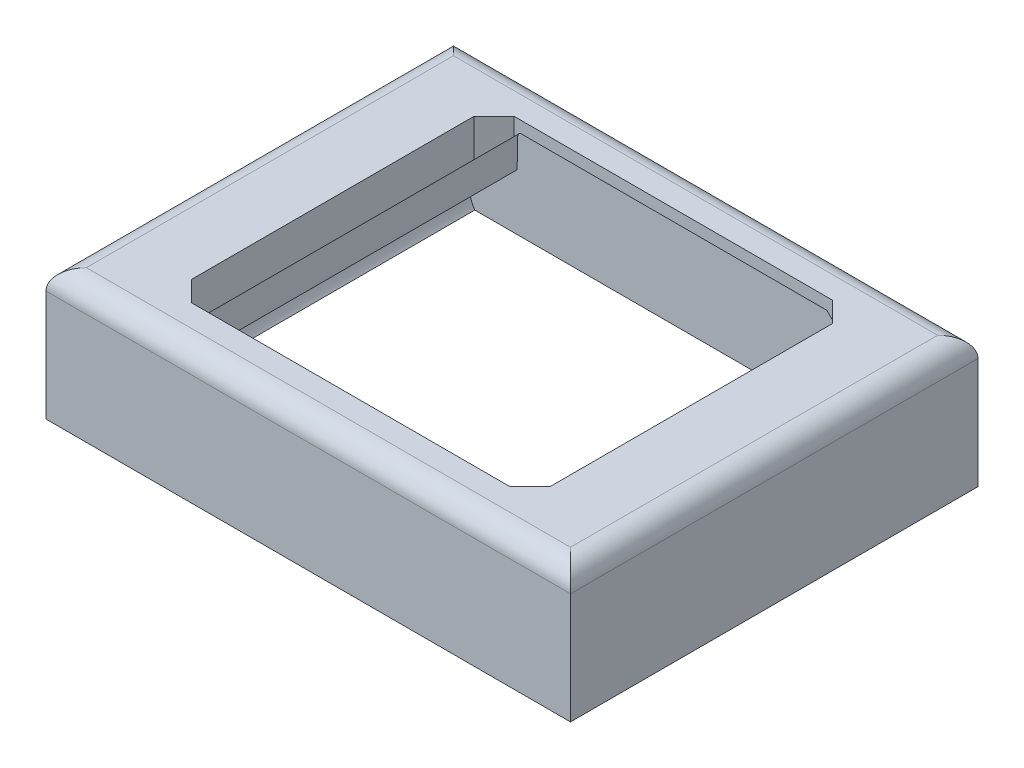
ISO-10303-21;
HEADER;
FILE_DESCRIPTION(('STEP AP214'),'2;1');
FILE_NAME('part.step','',(''),(''),'','','');
FILE_SCHEMA(('AUTOMOTIVE_DESIGN { 1 0 10303 214 1 1 1 1 }'));
ENDSEC;
DATA;
#1=APPLICATION_CONTEXT('core data for automotive mechanical design processes');
#2=APPLICATION_PROTOCOL_DEFINITION('international standard','automotive_design',2000,#1);
#3=PRODUCT_CONTEXT('',#1,'mechanical');
#4=PRODUCT('Part','Part','',(#3));
#5=PRODUCT_RELATED_PRODUCT_CATEGORY('part','',(#4));
#6=PRODUCT_DEFINITION_FORMATION('','',#4);
#7=PRODUCT_DEFINITION_CONTEXT('part definition',#1,'design');
#8=PRODUCT_DEFINITION('design','',#6,#7);
#9=PRODUCT_DEFINITION_SHAPE('','',#8);
#10=(LENGTH_UNIT() NAMED_UNIT(*) SI_UNIT(.MILLI.,.METRE.));
#11=(NAMED_UNIT(*) PLANE_ANGLE_UNIT() SI_UNIT($,.RADIAN.));
#12=(NAMED_UNIT(*) SI_UNIT($,.STERADIAN.) SOLID_ANGLE_UNIT());
#13=UNCERTAINTY_MEASURE_WITH_UNIT(LENGTH_MEASURE(1.E-05),#10,'distance_accuracy_value','');
#14=(GEOMETRIC_REPRESENTATION_CONTEXT(3) GLOBAL_UNCERTAINTY_ASSIGNED_CONTEXT((#13)) GLOBAL_UNIT_ASSIGNED_CONTEXT((#10,
#11,#12)) REPRESENTATION_CONTEXT('',''));
#15=CARTESIAN_POINT('',(0.,0.,0.));
#16=DIRECTION('',(0.,0.,1.));
#17=DIRECTION('',(1.,0.,0.));
#18=AXIS2_PLACEMENT_3D('',#15,#16,#17);
#19=CARTESIAN_POINT('',(26.732778086294,-30.0375899690606,25.654));
#20=DIRECTION('',(0.,0.,-1.));
#21=DIRECTION('',(-1.,0.,0.));
#22=AXIS2_PLACEMENT_3D('',#19,#20,#21);
#23=CYLINDRICAL_SURFACE('',#22,2.92881758219847);
#24=CARTESIAN_POINT('',(26.732778086294,-30.0375899690606,-24.13));
#25=DIRECTION('',(0.,0.,-1.));
#26=DIRECTION('',(-1.,0.,0.));
#27=AXIS2_PLACEMENT_3D('',#24,#25,#26);
#28=CIRCLE('',#27,2.92881758219847);
#29=CARTESIAN_POINT('',(29.0229942208002,-31.8632083538942,-24.13));
#30=VERTEX_POINT('',#29);
#31=CARTESIAN_POINT('',(27.8648686648209,-27.3364155297091,-24.13));
#32=VERTEX_POINT('',#31);
#33=EDGE_CURVE('E328',#30,#32,#28,.F.);
#34=ORIENTED_EDGE('',*,*,#33,.F.);
#35=DIRECTION('',(0.,0.,-1.));
#36=VECTOR('',#35,1.);
#37=CARTESIAN_POINT('',(29.0229942208002,-31.8632083538942,25.654));
#38=LINE('',#37,#36);
#39=CARTESIAN_POINT('',(29.0229942208002,-31.8632083538942,24.13));
#40=VERTEX_POINT('',#39);
#41=EDGE_CURVE('E404',#40,#30,#38,.T.);
#42=ORIENTED_EDGE('',*,*,#41,.F.);
#43=CARTESIAN_POINT('',(26.732778086294,-30.0375899690606,24.13));
#44=DIRECTION('',(0.,0.,1.));
#45=DIRECTION('',(1.,0.,0.));
#46=AXIS2_PLACEMENT_3D('',#43,#44,#45);
#47=CIRCLE('',#46,2.92881758219847);
#48=CARTESIAN_POINT('',(27.8648686648209,-27.3364155297091,24.13));
#49=VERTEX_POINT('',#48);
#50=EDGE_CURVE('E358',#49,#40,#47,.F.);
#51=ORIENTED_EDGE('',*,*,#50,.F.);
#52=DIRECTION('',(0.,0.,-1.));
#53=VECTOR('',#52,1.);
#54=CARTESIAN_POINT('',(27.8648686648209,-27.3364155297091,25.654));
#55=LINE('',#54,#53);
#56=EDGE_CURVE('E361',#49,#32,#55,.T.);
#57=ORIENTED_EDGE('',*,*,#56,.T.);
#58=EDGE_LOOP('',(#34,#42,#51,#57));
#59=FACE_BOUND('',#58,.T.);
#60=ADVANCED_FACE('F53',(#59),#23,.F.);
#61=CARTESIAN_POINT('',(-26.3052505575541,-30.027160069853,25.654));
#62=DIRECTION('',(0.,0.,-1.));
#63=DIRECTION('',(-1.,0.,0.));
#64=AXIS2_PLACEMENT_3D('',#61,#62,#63);
#65=CYLINDRICAL_SURFACE('',#64,3.11006669073643);
#66=DIRECTION('',(0.,0.,-1.));
#67=VECTOR('',#66,1.);
#68=CARTESIAN_POINT('',(-28.8155177782893,-31.8632083538942,25.654));
#69=LINE('',#68,#67);
#70=CARTESIAN_POINT('',(-28.8155177782893,-31.8632083538942,24.13));
#71=VERTEX_POINT('',#70);
#72=CARTESIAN_POINT('',(-28.8155177782893,-31.8632083538942,-24.13));
#73=VERTEX_POINT('',#72);
#74=EDGE_CURVE('E418',#71,#73,#69,.T.);
#75=ORIENTED_EDGE('',*,*,#74,.T.);
#76=CARTESIAN_POINT('',(-26.3052505575541,-30.027160069853,-24.13));
#77=DIRECTION('',(0.,0.,-1.));
#78=DIRECTION('',(-1.,0.,0.));
#79=AXIS2_PLACEMENT_3D('',#76,#77,#78);
#80=CIRCLE('',#79,3.11006669073643);
#81=CARTESIAN_POINT('',(-27.8648686648208,-27.3364155297091,-24.13));
#82=VERTEX_POINT('',#81);
#83=EDGE_CURVE('E325',#73,#82,#80,.T.);
#84=ORIENTED_EDGE('',*,*,#83,.T.);
#85=DIRECTION('',(0.,0.,-1.));
#86=VECTOR('',#85,1.);
#87=CARTESIAN_POINT('',(-27.8648686648208,-27.3364155297091,25.654));
#88=LINE('',#87,#86);
#89=CARTESIAN_POINT('',(-27.8648686648208,-27.3364155297091,24.13));
#90=VERTEX_POINT('',#89);
#91=EDGE_CURVE('E421',#90,#82,#88,.T.);
#92=ORIENTED_EDGE('',*,*,#91,.F.);
#93=CARTESIAN_POINT('',(-26.3052505575541,-30.027160069853,24.13));
#94=DIRECTION('',(0.,0.,1.));
#95=DIRECTION('',(1.,0.,0.));
#96=AXIS2_PLACEMENT_3D('',#93,#94,#95);
#97=CIRCLE('',#96,3.11006669073643);
#98=EDGE_CURVE('E354',#90,#71,#97,.T.);
#99=ORIENTED_EDGE('',*,*,#98,.T.);
#100=EDGE_LOOP('',(#75,#84,#92,#99));
#101=FACE_BOUND('',#100,.T.);
#102=ADVANCED_FACE('F585',(#101),#65,.F.);
#103=CARTESIAN_POINT('',(4.85286900296527,-8.37245394428451,25.654));
#104=DIRECTION('',(0.501474168355331,-0.865172617731473,0.));
#105=DIRECTION('',(0.865172617731473,0.501474168355331,0.));
#106=AXIS2_PLACEMENT_3D('',#103,#104,#105);
#107=PLANE('',#106);
#108=ORIENTED_EDGE('',*,*,#91,.T.);
#109=DIRECTION('',(0.865172617731473,0.501474168355331,0.));
#110=VECTOR('',#109,1.);
#111=CARTESIAN_POINT('',(4.85286900296527,-8.37245394428451,-24.13));
#112=LINE('',#111,#110);
#113=CARTESIAN_POINT('',(-23.4871255505307,-24.798973818634,-24.13));
#114=VERTEX_POINT('',#113);
#115=EDGE_CURVE('E322',#82,#114,#112,.T.);
#116=ORIENTED_EDGE('',*,*,#115,.T.);
#117=DIRECTION('',(0.,0.,-1.));
#118=VECTOR('',#117,1.);
#119=CARTESIAN_POINT('',(-23.4871255505307,-24.798973818634,25.654));
#120=LINE('',#119,#118);
#121=CARTESIAN_POINT('',(-23.4871255505307,-24.798973818634,24.13));
#122=VERTEX_POINT('',#121);
#123=EDGE_CURVE('E426',#122,#114,#120,.T.);
#124=ORIENTED_EDGE('',*,*,#123,.F.);
#125=DIRECTION('',(-0.865172617731473,-0.501474168355331,0.));
#126=VECTOR('',#125,1.);
#127=CARTESIAN_POINT('',(4.85286900296527,-8.37245394428451,24.13));
#128=LINE('',#127,#126);
#129=EDGE_CURVE('E350',#122,#90,#128,.T.);
#130=ORIENTED_EDGE('',*,*,#129,.T.);
#131=EDGE_LOOP('',(#108,#116,#124,#130));
#132=FACE_BOUND('',#131,.T.);
#133=ADVANCED_FACE('F590',(#132),#107,.T.);
#134=CARTESIAN_POINT('',(-4.85286900296523,-8.37245394428442,25.654));
#135=DIRECTION('',(0.501474168355332,0.865172617731472,0.));
#136=DIRECTION('',(-0.865172617731472,0.501474168355332,0.));
#137=AXIS2_PLACEMENT_3D('',#134,#135,#136);
#138=PLANE('',#137);
#139=DIRECTION('',(-0.865172617731472,0.501474168355332,0.));
#140=VECTOR('',#139,1.);
#141=CARTESIAN_POINT('',(-4.85286900296523,-8.37245394428442,-24.13));
#142=LINE('',#141,#140);
#143=CARTESIAN_POINT('',(23.4871255505309,-24.798973818634,-24.13));
#144=VERTEX_POINT('',#143);
#145=EDGE_CURVE('E318',#32,#144,#142,.T.);
#146=ORIENTED_EDGE('',*,*,#145,.F.);
#147=ORIENTED_EDGE('',*,*,#56,.F.);
#148=DIRECTION('',(0.865172617731472,-0.501474168355332,0.));
#149=VECTOR('',#148,1.);
#150=CARTESIAN_POINT('',(-4.85286900296523,-8.37245394428442,24.13));
#151=LINE('',#150,#149);
#152=CARTESIAN_POINT('',(23.4871255505309,-24.798973818634,24.13));
#153=VERTEX_POINT('',#152);
#154=EDGE_CURVE('E347',#153,#49,#151,.T.);
#155=ORIENTED_EDGE('',*,*,#154,.F.);
#156=DIRECTION('',(0.,0.,-1.));
#157=VECTOR('',#156,1.);
#158=CARTESIAN_POINT('',(23.4871255505309,-24.798973818634,25.654));
#159=LINE('',#158,#157);
#160=EDGE_CURVE('E425',#153,#144,#159,.T.);
#161=ORIENTED_EDGE('',*,*,#160,.T.);
#162=EDGE_LOOP('',(#146,#147,#155,#161));
#163=FACE_BOUND('',#162,.T.);
#164=ADVANCED_FACE('F573',(#163),#138,.F.);
#165=CARTESIAN_POINT('',(-22.9392753116274,0.496813454510893,25.654));
#166=DIRECTION('',(0.999765553062039,-0.0216526882985698,0.));
#167=DIRECTION('',(0.0216526882985698,0.999765553062039,0.));
#168=AXIS2_PLACEMENT_3D('',#165,#166,#167);
#169=PLANE('',#168);
#170=ORIENTED_EDGE('',*,*,#123,.T.);
#171=DIRECTION('',(0.0216526882985698,0.999765553062039,0.));
#172=VECTOR('',#171,1.);
#173=CARTESIAN_POINT('',(-22.9392753116274,0.496813454510893,-24.13));
#174=LINE('',#173,#172);
#175=CARTESIAN_POINT('',(-23.4027811511319,-20.904555539025,-24.13));
#176=VERTEX_POINT('',#175);
#177=EDGE_CURVE('E315',#114,#176,#174,.T.);
#178=ORIENTED_EDGE('',*,*,#177,.T.);
#179=DIRECTION('',(0.,0.,-1.));
#180=VECTOR('',#179,1.);
#181=CARTESIAN_POINT('',(-23.4027811511319,-20.904555539025,25.654));
#182=LINE('',#181,#180);
#183=CARTESIAN_POINT('',(-23.4027811511319,-20.904555539025,24.13));
#184=VERTEX_POINT('',#183);
#185=EDGE_CURVE('E239',#184,#176,#182,.T.);
#186=ORIENTED_EDGE('',*,*,#185,.F.);
#187=DIRECTION('',(-0.0216526882985698,-0.999765553062039,0.));
#188=VECTOR('',#187,1.);
#189=CARTESIAN_POINT('',(-22.9392753116274,0.496813454510893,24.13));
#190=LINE('',#189,#188);
#191=EDGE_CURVE('E343',#184,#122,#190,.T.);
#192=ORIENTED_EDGE('',*,*,#191,.T.);
#193=EDGE_LOOP('',(#170,#178,#186,#192));
#194=FACE_BOUND('',#193,.T.);
#195=ADVANCED_FACE('F592',(#194),#169,.T.);
#196=CARTESIAN_POINT('',(22.9392753116276,0.496813454510837,25.654));
#197=DIRECTION('',(0.999765553062039,0.0216526882985671,0.));
#198=DIRECTION('',(-0.0216526882985671,0.999765553062039,0.));
#199=AXIS2_PLACEMENT_3D('',#196,#197,#198);
#200=PLANE('',#199);
#201=DIRECTION('',(-0.0216526882985671,0.999765553062039,0.));
#202=VECTOR('',#201,1.);
#203=CARTESIAN_POINT('',(22.9392753116276,0.496813454510837,-24.13));
#204=LINE('',#203,#202);
#205=CARTESIAN_POINT('',(23.4027811511321,-20.904555539025,-24.13));
#206=VERTEX_POINT('',#205);
#207=EDGE_CURVE('E312',#144,#206,#204,.T.);
#208=ORIENTED_EDGE('',*,*,#207,.F.);
#209=ORIENTED_EDGE('',*,*,#160,.F.);
#210=DIRECTION('',(0.0216526882985671,-0.999765553062039,0.));
#211=VECTOR('',#210,1.);
#212=CARTESIAN_POINT('',(22.9392753116276,0.496813454510837,24.13));
#213=LINE('',#212,#211);
#214=CARTESIAN_POINT('',(23.4027811511321,-20.904555539025,24.13));
#215=VERTEX_POINT('',#214);
#216=EDGE_CURVE('E340',#215,#153,#213,.T.);
#217=ORIENTED_EDGE('',*,*,#216,.F.);
#218=DIRECTION('',(0.,0.,-1.));
#219=VECTOR('',#218,1.);
#220=CARTESIAN_POINT('',(23.4027811511321,-20.904555539025,25.654));
#221=LINE('',#220,#219);
#222=EDGE_CURVE('E438',#215,#206,#221,.T.);
#223=ORIENTED_EDGE('',*,*,#222,.T.);
#224=EDGE_LOOP('',(#208,#209,#217,#223));
#225=FACE_BOUND('',#224,.T.);
#226=ADVANCED_FACE('F569',(#225),#200,.F.);
#227=CARTESIAN_POINT('',(1.24911280605351,1.24911280605351,25.654));
#228=DIRECTION('',(0.707106781186547,0.707106781186548,0.));
#229=DIRECTION('',(-0.707106781186548,0.707106781186547,0.));
#230=AXIS2_PLACEMENT_3D('',#227,#228,#229);
#231=PLANE('',#230);
#232=DIRECTION('',(-0.707106781186548,0.707106781186547,0.));
#233=VECTOR('',#232,1.);
#234=CARTESIAN_POINT('',(1.24911280605351,1.24911280605351,-24.13));
#235=LINE('',#234,#233);
#236=CARTESIAN_POINT('',(19.313025612107,-16.8148,-24.13));
#237=VERTEX_POINT('',#236);
#238=EDGE_CURVE('E251',#206,#237,#235,.T.);
#239=ORIENTED_EDGE('',*,*,#238,.F.);
#240=ORIENTED_EDGE('',*,*,#222,.F.);
#241=DIRECTION('',(0.707106781186548,-0.707106781186547,0.));
#242=VECTOR('',#241,1.);
#243=CARTESIAN_POINT('',(1.24911280605351,1.24911280605351,24.13));
#244=LINE('',#243,#242);
#245=CARTESIAN_POINT('',(19.313025612107,-16.8148,24.13));
#246=VERTEX_POINT('',#245);
#247=EDGE_CURVE('E337',#246,#215,#244,.T.);
#248=ORIENTED_EDGE('',*,*,#247,.F.);
#249=DIRECTION('',(0.,0.,-1.));
#250=VECTOR('',#249,1.);
#251=CARTESIAN_POINT('',(19.313025612107,-16.8148,25.654));
#252=LINE('',#251,#250);
#253=CARTESIAN_POINT('',(19.313025612107,-16.8148,20.32));
#254=VERTEX_POINT('',#253);
#255=EDGE_CURVE('E399',#246,#254,#252,.T.);
#256=ORIENTED_EDGE('',*,*,#255,.T.);
#257=DIRECTION('',(0.707106781186548,-0.707106781186547,0.));
#258=VECTOR('',#257,1.);
#259=CARTESIAN_POINT('',(1.24911280605351,1.24911280605351,20.32));
#260=LINE('',#259,#258);
#261=CARTESIAN_POINT('',(20.0429518698429,-17.5447262577359,20.32));
#262=VERTEX_POINT('',#261);
#263=EDGE_CURVE('E395',#254,#262,#260,.T.);
#264=ORIENTED_EDGE('',*,*,#263,.T.);
#265=DIRECTION('',(0.577350269189626,-0.577350269189626,-0.577350269189626));
#266=VECTOR('',#265,1.);
#267=CARTESIAN_POINT('',(5.73572582731665,-3.23750021520963,34.6272260425263));
#268=LINE('',#267,#266);
#269=CARTESIAN_POINT('',(22.5829518698429,-20.0847262577359,17.78));
#270=VERTEX_POINT('',#269);
#271=EDGE_CURVE('E391',#262,#270,#268,.T.);
#272=ORIENTED_EDGE('',*,*,#271,.T.);
#273=DIRECTION('',(0.,0.,-1.));
#274=VECTOR('',#273,1.);
#275=CARTESIAN_POINT('',(22.5829518698429,-20.0847262577359,25.654));
#276=LINE('',#275,#274);
#277=CARTESIAN_POINT('',(22.5829518698429,-20.0847262577359,-17.78));
#278=VERTEX_POINT('',#277);
#279=EDGE_CURVE('E387',#270,#278,#276,.T.);
#280=ORIENTED_EDGE('',*,*,#279,.T.);
#281=DIRECTION('',(-0.577350269189626,0.577350269189626,-0.577350269189626));
#282=VECTOR('',#281,1.);
#283=CARTESIAN_POINT('',(22.8383924939833,-20.3401668818763,-17.5245593758596));
#284=LINE('',#283,#282);
#285=CARTESIAN_POINT('',(20.0429518698429,-17.5447262577359,-20.32));
#286=VERTEX_POINT('',#285);
#287=EDGE_CURVE('E382',#278,#286,#284,.T.);
#288=ORIENTED_EDGE('',*,*,#287,.T.);
#289=DIRECTION('',(-0.707106781186548,0.707106781186547,0.));
#290=VECTOR('',#289,1.);
#291=CARTESIAN_POINT('',(1.24911280605351,1.24911280605351,-20.32));
#292=LINE('',#291,#290);
#293=CARTESIAN_POINT('',(19.313025612107,-16.8148,-20.32));
#294=VERTEX_POINT('',#293);
#295=EDGE_CURVE('E377',#286,#294,#292,.T.);
#296=ORIENTED_EDGE('',*,*,#295,.T.);
#297=EDGE_CURVE('E381',#294,#237,#252,.T.);
#298=ORIENTED_EDGE('',*,*,#297,.T.);
#299=EDGE_LOOP('',(#239,#240,#248,#256,#264,#272,#280,#288,#296,#298));
#300=FACE_BOUND('',#299,.T.);
#301=ADVANCED_FACE('F563',(#300),#231,.F.);
#302=CARTESIAN_POINT('',(-1.24911280605345,1.24911280605345,25.654));
#303=DIRECTION('',(0.707106781186548,-0.707106781186548,0.));
#304=DIRECTION('',(0.707106781186548,0.707106781186548,0.));
#305=AXIS2_PLACEMENT_3D('',#302,#303,#304);
#306=PLANE('',#305);
#307=ORIENTED_EDGE('',*,*,#185,.T.);
#308=DIRECTION('',(0.707106781186548,0.707106781186548,0.));
#309=VECTOR('',#308,1.);
#310=CARTESIAN_POINT('',(-1.24911280605345,1.24911280605345,-24.13));
#311=LINE('',#310,#309);
#312=CARTESIAN_POINT('',(-19.3130256121069,-16.8148,-24.13));
#313=VERTEX_POINT('',#312);
#314=EDGE_CURVE('E244',#176,#313,#311,.T.);
#315=ORIENTED_EDGE('',*,*,#314,.T.);
#316=DIRECTION('',(0.,0.,-1.));
#317=VECTOR('',#316,1.);
#318=CARTESIAN_POINT('',(-19.3130256121069,-16.8148,25.654));
#319=LINE('',#318,#317);
#320=CARTESIAN_POINT('',(-19.3130256121069,-16.8148,-20.32));
#321=VERTEX_POINT('',#320);
#322=EDGE_CURVE('E228',#321,#313,#319,.T.);
#323=ORIENTED_EDGE('',*,*,#322,.F.);
#324=DIRECTION('',(0.707106781186548,0.707106781186548,0.));
#325=VECTOR('',#324,1.);
#326=CARTESIAN_POINT('',(-1.24911280605345,1.24911280605345,-20.32));
#327=LINE('',#326,#325);
#328=CARTESIAN_POINT('',(-20.042951869843,-17.5447262577361,-20.32));
#329=VERTEX_POINT('',#328);
#330=EDGE_CURVE('E460',#329,#321,#327,.T.);
#331=ORIENTED_EDGE('',*,*,#330,.F.);
#332=DIRECTION('',(0.577350269189626,0.577350269189626,-0.577350269189626));
#333=VECTOR('',#332,1.);
#334=CARTESIAN_POINT('',(-22.8383924939833,-20.3401668818764,-17.5245593758597));
#335=LINE('',#334,#333);
#336=CARTESIAN_POINT('',(-22.5829518698429,-20.0847262577361,-17.78));
#337=VERTEX_POINT('',#336);
#338=EDGE_CURVE('E362',#337,#329,#335,.T.);
#339=ORIENTED_EDGE('',*,*,#338,.F.);
#340=DIRECTION('',(0.,0.,-1.));
#341=VECTOR('',#340,1.);
#342=CARTESIAN_POINT('',(-22.5829518698429,-20.084726257736,25.654));
#343=LINE('',#342,#341);
#344=CARTESIAN_POINT('',(-22.5829518698429,-20.0847262577361,17.78));
#345=VERTEX_POINT('',#344);
#346=EDGE_CURVE('E367',#345,#337,#343,.T.);
#347=ORIENTED_EDGE('',*,*,#346,.F.);
#348=DIRECTION('',(-0.577350269189626,-0.577350269189626,-0.577350269189626));
#349=VECTOR('',#348,1.);
#350=CARTESIAN_POINT('',(-5.73572582731661,-3.23750021520971,34.6272260425263));
#351=LINE('',#350,#349);
#352=CARTESIAN_POINT('',(-20.042951869843,-17.5447262577361,20.32));
#353=VERTEX_POINT('',#352);
#354=EDGE_CURVE('E372',#353,#345,#351,.T.);
#355=ORIENTED_EDGE('',*,*,#354,.F.);
#356=DIRECTION('',(-0.707106781186548,-0.707106781186548,0.));
#357=VECTOR('',#356,1.);
#358=CARTESIAN_POINT('',(-1.24911280605345,1.24911280605345,20.32));
#359=LINE('',#358,#357);
#360=CARTESIAN_POINT('',(-19.3130256121069,-16.8148,20.32));
#361=VERTEX_POINT('',#360);
#362=EDGE_CURVE('E432',#361,#353,#359,.T.);
#363=ORIENTED_EDGE('',*,*,#362,.F.);
#364=CARTESIAN_POINT('',(-19.3130256121069,-16.8148,24.13));
#365=VERTEX_POINT('',#364);
#366=EDGE_CURVE('E241',#365,#361,#319,.T.);
#367=ORIENTED_EDGE('',*,*,#366,.F.);
#368=DIRECTION('',(-0.707106781186548,-0.707106781186548,0.));
#369=VECTOR('',#368,1.);
#370=CARTESIAN_POINT('',(-1.24911280605345,1.24911280605345,24.13));
#371=LINE('',#370,#369);
#372=EDGE_CURVE('E260',#365,#184,#371,.T.);
#373=ORIENTED_EDGE('',*,*,#372,.T.);
#374=EDGE_LOOP('',(#307,#315,#323,#331,#339,#347,#355,#363,#367,#373));
#375=FACE_BOUND('',#374,.T.);
#376=ADVANCED_FACE('F245',(#375),#306,.T.);
#377=CARTESIAN_POINT('',(0.,-16.8148,25.654));
#378=DIRECTION('',(0.,1.,0.));
#379=DIRECTION('',(0.,0.,1.));
#380=AXIS2_PLACEMENT_3D('',#377,#378,#379);
#381=PLANE('',#380);
#382=DIRECTION('',(-1.,0.,0.));
#383=VECTOR('',#382,1.);
#384=CARTESIAN_POINT('',(0.,-16.8148,-24.13));
#385=LINE('',#384,#383);
#386=EDGE_CURVE('E233',#237,#313,#385,.T.);
#387=ORIENTED_EDGE('',*,*,#386,.F.);
#388=ORIENTED_EDGE('',*,*,#297,.F.);
#389=DIRECTION('',(-1.,0.,0.));
#390=VECTOR('',#389,1.);
#391=CARTESIAN_POINT('',(0.,-16.8148,-20.32));
#392=LINE('',#391,#390);
#393=EDGE_CURVE('E235',#294,#321,#392,.T.);
#394=ORIENTED_EDGE('',*,*,#393,.T.);
#395=ORIENTED_EDGE('',*,*,#322,.T.);
#396=EDGE_LOOP('',(#387,#388,#394,#395));
#397=FACE_BOUND('',#396,.T.);
#398=ADVANCED_FACE('F230',(#397),#381,.F.);
#399=DIRECTION('',(1.,0.,0.));
#400=VECTOR('',#399,1.);
#401=CARTESIAN_POINT('',(0.,-16.8148,24.13));
#402=LINE('',#401,#400);
#403=EDGE_CURVE('E334',#365,#246,#402,.T.);
#404=ORIENTED_EDGE('',*,*,#403,.F.);
#405=ORIENTED_EDGE('',*,*,#366,.T.);
#406=DIRECTION('',(1.,0.,0.));
#407=VECTOR('',#406,1.);
#408=CARTESIAN_POINT('',(0.,-16.8148,20.32));
#409=LINE('',#408,#407);
#410=EDGE_CURVE('E435',#361,#254,#409,.T.);
#411=ORIENTED_EDGE('',*,*,#410,.T.);
#412=ORIENTED_EDGE('',*,*,#255,.F.);
#413=EDGE_LOOP('',(#404,#405,#411,#412));
#414=FACE_BOUND('',#413,.T.);
#415=ADVANCED_FACE('F541',(#414),#381,.F.);
#416=CARTESIAN_POINT('',(0.,-31.8632083538942,25.654));
#417=DIRECTION('',(0.,1.,0.));
#418=DIRECTION('',(0.,0.,1.));
#419=AXIS2_PLACEMENT_3D('',#416,#417,#418);
#420=PLANE('',#419);
#421=DIRECTION('',(0.,0.,-1.));
#422=VECTOR('',#421,1.);
#423=CARTESIAN_POINT('',(-33.0199999999999,-31.8632083538942,25.654));
#424=LINE('',#423,#422);
#425=CARTESIAN_POINT('',(-33.0199999999999,-31.8632083538942,25.654));
#426=VERTEX_POINT('',#425);
#427=CARTESIAN_POINT('',(-33.0199999999999,-31.8632083538942,-25.654));
#428=VERTEX_POINT('',#427);
#429=EDGE_CURVE('E408',#426,#428,#424,.T.);
#430=ORIENTED_EDGE('',*,*,#429,.T.);
#431=DIRECTION('',(1.,0.,0.));
#432=VECTOR('',#431,1.);
#433=CARTESIAN_POINT('',(0.,-31.8632083538942,-25.654));
#434=LINE('',#433,#432);
#435=CARTESIAN_POINT('',(33.0200000000001,-31.8632083538942,-25.654));
#436=VERTEX_POINT('',#435);
#437=EDGE_CURVE('E403',#428,#436,#434,.T.);
#438=ORIENTED_EDGE('',*,*,#437,.T.);
#439=DIRECTION('',(0.,0.,-1.));
#440=VECTOR('',#439,1.);
#441=CARTESIAN_POINT('',(33.0200000000001,-31.8632083538942,25.654));
#442=LINE('',#441,#440);
#443=CARTESIAN_POINT('',(33.0200000000001,-31.8632083538942,25.654));
#444=VERTEX_POINT('',#443);
#445=EDGE_CURVE('E409',#444,#436,#442,.T.);
#446=ORIENTED_EDGE('',*,*,#445,.F.);
#447=DIRECTION('',(1.,0.,0.));
#448=VECTOR('',#447,1.);
#449=CARTESIAN_POINT('',(0.,-31.8632083538942,25.654));
#450=LINE('',#449,#448);
#451=EDGE_CURVE('E430',#426,#444,#450,.T.);
#452=ORIENTED_EDGE('',*,*,#451,.F.);
#453=EDGE_LOOP('',(#430,#438,#446,#452));
#454=FACE_BOUND('',#453,.T.);
#455=ORIENTED_EDGE('',*,*,#41,.T.);
#456=DIRECTION('',(1.,0.,0.));
#457=VECTOR('',#456,1.);
#458=CARTESIAN_POINT('',(33.0200000000001,-31.8632083538942,-24.13));
#459=LINE('',#458,#457);
#460=EDGE_CURVE('E252',#73,#30,#459,.T.);
#461=ORIENTED_EDGE('',*,*,#460,.F.);
#462=ORIENTED_EDGE('',*,*,#74,.F.);
#463=DIRECTION('',(-1.,0.,0.));
#464=VECTOR('',#463,1.);
#465=CARTESIAN_POINT('',(-33.02,-31.8632083538942,24.13));
#466=LINE('',#465,#464);
#467=EDGE_CURVE('E331',#40,#71,#466,.T.);
#468=ORIENTED_EDGE('',*,*,#467,.F.);
#469=EDGE_LOOP('',(#455,#461,#462,#468));
#470=FACE_BOUND('',#469,.T.);
#471=ADVANCED_FACE('F583',(#454,#470),#420,.F.);
#472=CARTESIAN_POINT('',(33.0200000000001,0.,25.654));
#473=DIRECTION('',(1.,0.,0.));
#474=DIRECTION('',(0.,1.,0.));
#475=AXIS2_PLACEMENT_3D('',#472,#473,#474);
#476=PLANE('',#475);
#477=DIRECTION('',(0.,-1.,0.));
#478=VECTOR('',#477,1.);
#479=CARTESIAN_POINT('',(33.0200000000001,0.,-25.654));
#480=LINE('',#479,#478);
#481=CARTESIAN_POINT('',(33.0200000000001,-17.8932083538942,-25.654));
#482=VERTEX_POINT('',#481);
#483=EDGE_CURVE('E386',#482,#436,#480,.T.);
#484=ORIENTED_EDGE('',*,*,#483,.F.);
#485=DIRECTION('',(0.,0.,-1.));
#486=VECTOR('',#485,1.);
#487=CARTESIAN_POINT('',(33.0200000000001,-17.8932083538942,25.654));
#488=LINE('',#487,#486);
#489=CARTESIAN_POINT('',(33.0200000000001,-17.8932083538942,25.654));
#490=VERTEX_POINT('',#489);
#491=EDGE_CURVE('E12',#482,#490,#488,.F.);
#492=ORIENTED_EDGE('',*,*,#491,.T.);
#493=DIRECTION('',(0.,-1.,0.));
#494=VECTOR('',#493,1.);
#495=CARTESIAN_POINT('',(33.0200000000001,0.,25.654));
#496=LINE('',#495,#494);
#497=EDGE_CURVE('E414',#490,#444,#496,.T.);
#498=ORIENTED_EDGE('',*,*,#497,.T.);
#499=ORIENTED_EDGE('',*,*,#445,.T.);
#500=EDGE_LOOP('',(#484,#492,#498,#499));
#501=FACE_BOUND('',#500,.T.);
#502=ADVANCED_FACE('F614',(#501),#476,.T.);
#503=CARTESIAN_POINT('',(-33.0199999999999,0.,25.654));
#504=DIRECTION('',(1.,0.,0.));
#505=DIRECTION('',(0.,0.,-1.));
#506=AXIS2_PLACEMENT_3D('',#503,#504,#505);
#507=PLANE('',#506);
#508=DIRECTION('',(0.,-1.,0.));
#509=VECTOR('',#508,1.);
#510=CARTESIAN_POINT('',(-33.0199999999999,0.,25.654));
#511=LINE('',#510,#509);
#512=CARTESIAN_POINT('',(-33.0199999999999,-17.8932083538942,25.654));
#513=VERTEX_POINT('',#512);
#514=EDGE_CURVE('E442',#513,#426,#511,.T.);
#515=ORIENTED_EDGE('',*,*,#514,.F.);
#516=DIRECTION('',(0.,0.,-1.));
#517=VECTOR('',#516,1.);
#518=CARTESIAN_POINT('',(-33.0199999999999,-17.8932083538942,-25.654));
#519=LINE('',#518,#517);
#520=CARTESIAN_POINT('',(-33.0199999999999,-17.8932083538942,-25.654));
#521=VERTEX_POINT('',#520);
#522=EDGE_CURVE('E78',#513,#521,#519,.T.);
#523=ORIENTED_EDGE('',*,*,#522,.T.);
#524=DIRECTION('',(0.,-1.,0.));
#525=VECTOR('',#524,1.);
#526=CARTESIAN_POINT('',(-33.0199999999999,0.,-25.654));
#527=LINE('',#526,#525);
#528=EDGE_CURVE('E413',#521,#428,#527,.T.);
#529=ORIENTED_EDGE('',*,*,#528,.T.);
#530=ORIENTED_EDGE('',*,*,#429,.F.);
#531=EDGE_LOOP('',(#515,#523,#529,#530));
#532=FACE_BOUND('',#531,.T.);
#533=ADVANCED_FACE('F618',(#532),#507,.F.);
#534=CARTESIAN_POINT('',(0.,0.,25.654));
#535=DIRECTION('',(0.,0.,1.));
#536=DIRECTION('',(1.,0.,0.));
#537=AXIS2_PLACEMENT_3D('',#534,#535,#536);
#538=PLANE('',#537);
#539=ORIENTED_EDGE('',*,*,#497,.F.);
#540=DIRECTION('',(1.,0.,0.));
#541=VECTOR('',#540,1.);
#542=CARTESIAN_POINT('',(0.,-17.8932083538942,25.654));
#543=LINE('',#542,#541);
#544=EDGE_CURVE('E279',#490,#513,#543,.F.);
#545=ORIENTED_EDGE('',*,*,#544,.T.);
#546=ORIENTED_EDGE('',*,*,#514,.T.);
#547=ORIENTED_EDGE('',*,*,#451,.T.);
#548=EDGE_LOOP('',(#539,#545,#546,#547));
#549=FACE_BOUND('',#548,.T.);
#550=ADVANCED_FACE('F623',(#549),#538,.T.);
#551=CARTESIAN_POINT('',(0.,-15.3532083538942,25.654));
#552=DIRECTION('',(0.,1.,0.));
#553=DIRECTION('',(-1.,0.,0.));
#554=AXIS2_PLACEMENT_3D('',#551,#552,#553);
#555=PLANE('',#554);
#556=DIRECTION('',(0.,0.,-1.));
#557=VECTOR('',#556,1.);
#558=CARTESIAN_POINT('',(-30.4799999999999,-15.3532083538942,25.654));
#559=LINE('',#558,#557);
#560=CARTESIAN_POINT('',(-30.4799999999999,-15.3532083538942,-23.114));
#561=VERTEX_POINT('',#560);
#562=CARTESIAN_POINT('',(-30.4799999999999,-15.3532083538942,23.114));
#563=VERTEX_POINT('',#562);
#564=EDGE_CURVE('E272',#561,#563,#559,.F.);
#565=ORIENTED_EDGE('',*,*,#564,.T.);
#566=DIRECTION('',(1.,0.,0.));
#567=VECTOR('',#566,1.);
#568=CARTESIAN_POINT('',(0.,-15.3532083538942,23.114));
#569=LINE('',#568,#567);
#570=CARTESIAN_POINT('',(30.4800000000001,-15.3532083538942,23.114));
#571=VERTEX_POINT('',#570);
#572=EDGE_CURVE('E275',#563,#571,#569,.T.);
#573=ORIENTED_EDGE('',*,*,#572,.T.);
#574=DIRECTION('',(0.,0.,-1.));
#575=VECTOR('',#574,1.);
#576=CARTESIAN_POINT('',(30.4800000000001,-15.3532083538942,25.654));
#577=LINE('',#576,#575);
#578=CARTESIAN_POINT('',(30.4800000000001,-15.3532083538942,-23.114));
#579=VERTEX_POINT('',#578);
#580=EDGE_CURVE('E259',#571,#579,#577,.T.);
#581=ORIENTED_EDGE('',*,*,#580,.T.);
#582=DIRECTION('',(1.,0.,0.));
#583=VECTOR('',#582,1.);
#584=CARTESIAN_POINT('',(-33.0199999999999,-15.3532083538942,-23.114));
#585=LINE('',#584,#583);
#586=EDGE_CURVE('E264',#579,#561,#585,.F.);
#587=ORIENTED_EDGE('',*,*,#586,.T.);
#588=EDGE_LOOP('',(#565,#573,#581,#587));
#589=FACE_BOUND('',#588,.T.);
#590=DIRECTION('',(0.707106781186548,0.,0.707106781186548));
#591=VECTOR('',#590,1.);
#592=CARTESIAN_POINT('',(-22.5829518698429,-15.3532083538942,17.78));
#593=LINE('',#592,#591);
#594=CARTESIAN_POINT('',(-22.5829518698429,-15.3532083538942,17.78));
#595=VERTEX_POINT('',#594);
#596=CARTESIAN_POINT('',(-20.0429518698429,-15.3532083538942,20.32));
#597=VERTEX_POINT('',#596);
#598=EDGE_CURVE('E266',#595,#597,#593,.T.);
#599=ORIENTED_EDGE('',*,*,#598,.F.);
#600=DIRECTION('',(0.,0.,1.));
#601=VECTOR('',#600,1.);
#602=CARTESIAN_POINT('',(-22.5829518698429,-15.3532083538942,-17.78));
#603=LINE('',#602,#601);
#604=CARTESIAN_POINT('',(-22.5829518698429,-15.3532083538942,-17.78));
#605=VERTEX_POINT('',#604);
#606=EDGE_CURVE('E376',#605,#595,#603,.T.);
#607=ORIENTED_EDGE('',*,*,#606,.F.);
#608=DIRECTION('',(-0.707106781186548,0.,0.707106781186548));
#609=VECTOR('',#608,1.);
#610=CARTESIAN_POINT('',(-20.0429518698429,-15.3532083538942,-20.32));
#611=LINE('',#610,#609);
#612=CARTESIAN_POINT('',(-20.0429518698429,-15.3532083538942,-20.32));
#613=VERTEX_POINT('',#612);
#614=EDGE_CURVE('E371',#613,#605,#611,.T.);
#615=ORIENTED_EDGE('',*,*,#614,.F.);
#616=DIRECTION('',(-1.,0.,0.));
#617=VECTOR('',#616,1.);
#618=CARTESIAN_POINT('',(-20.0429518698429,-15.3532083538942,-20.32));
#619=LINE('',#618,#617);
#620=CARTESIAN_POINT('',(20.0429518698429,-15.3532083538942,-20.32));
#621=VERTEX_POINT('',#620);
#622=EDGE_CURVE('E366',#621,#613,#619,.T.);
#623=ORIENTED_EDGE('',*,*,#622,.F.);
#624=DIRECTION('',(-0.707106781186548,0.,-0.707106781186548));
#625=VECTOR('',#624,1.);
#626=CARTESIAN_POINT('',(20.0429518698429,-15.3532083538942,-20.32));
#627=LINE('',#626,#625);
#628=CARTESIAN_POINT('',(22.5829518698429,-15.3532083538942,-17.78));
#629=VERTEX_POINT('',#628);
#630=EDGE_CURVE('E464',#629,#621,#627,.T.);
#631=ORIENTED_EDGE('',*,*,#630,.F.);
#632=DIRECTION('',(0.,0.,-1.));
#633=VECTOR('',#632,1.);
#634=CARTESIAN_POINT('',(22.5829518698429,-15.3532083538942,-17.78));
#635=LINE('',#634,#633);
#636=CARTESIAN_POINT('',(22.5829518698429,-15.3532083538942,17.78));
#637=VERTEX_POINT('',#636);
#638=EDGE_CURVE('E486',#637,#629,#635,.T.);
#639=ORIENTED_EDGE('',*,*,#638,.F.);
#640=DIRECTION('',(0.707106781186548,0.,-0.707106781186548));
#641=VECTOR('',#640,1.);
#642=CARTESIAN_POINT('',(20.0429518698429,-15.3532083538942,20.32));
#643=LINE('',#642,#641);
#644=CARTESIAN_POINT('',(20.0429518698429,-15.3532083538942,20.32));
#645=VERTEX_POINT('',#644);
#646=EDGE_CURVE('E491',#645,#637,#643,.T.);
#647=ORIENTED_EDGE('',*,*,#646,.F.);
#648=DIRECTION('',(1.,0.,0.));
#649=VECTOR('',#648,1.);
#650=CARTESIAN_POINT('',(-20.0429518698429,-15.3532083538942,20.32));
#651=LINE('',#650,#649);
#652=EDGE_CURVE('E496',#597,#645,#651,.T.);
#653=ORIENTED_EDGE('',*,*,#652,.F.);
#654=EDGE_LOOP('',(#599,#607,#615,#623,#631,#639,#647,#653));
#655=FACE_BOUND('',#654,.T.);
#656=ADVANCED_FACE('F528',(#589,#655),#555,.T.);
#657=CARTESIAN_POINT('',(0.,0.,-25.654));
#658=DIRECTION('',(0.,0.,1.));
#659=DIRECTION('',(1.,0.,0.));
#660=AXIS2_PLACEMENT_3D('',#657,#658,#659);
#661=PLANE('',#660);
#662=ORIENTED_EDGE('',*,*,#528,.F.);
#663=DIRECTION('',(1.,0.,0.));
#664=VECTOR('',#663,1.);
#665=CARTESIAN_POINT('',(33.0200000000001,-17.8932083538942,-25.654));
#666=LINE('',#665,#664);
#667=EDGE_CURVE('E63',#521,#482,#666,.T.);
#668=ORIENTED_EDGE('',*,*,#667,.T.);
#669=ORIENTED_EDGE('',*,*,#483,.T.);
#670=ORIENTED_EDGE('',*,*,#437,.F.);
#671=EDGE_LOOP('',(#662,#668,#669,#670));
#672=FACE_BOUND('',#671,.T.);
#673=ADVANCED_FACE('F622',(#672),#661,.F.);
#674=CARTESIAN_POINT('',(-20.0429518698429,-92.1148749731631,20.32));
#675=DIRECTION('',(0.,0.,1.));
#676=DIRECTION('',(1.,0.,0.));
#677=AXIS2_PLACEMENT_3D('',#674,#675,#676);
#678=PLANE('',#677);
#679=ORIENTED_EDGE('',*,*,#362,.T.);
#680=DIRECTION('',(0.,1.,0.));
#681=VECTOR('',#680,1.);
#682=CARTESIAN_POINT('',(-20.0429518698429,-92.1148749731631,20.32));
#683=LINE('',#682,#681);
#684=EDGE_CURVE('E469',#353,#597,#683,.T.);
#685=ORIENTED_EDGE('',*,*,#684,.T.);
#686=ORIENTED_EDGE('',*,*,#652,.T.);
#687=DIRECTION('',(0.,1.,0.));
#688=VECTOR('',#687,1.);
#689=CARTESIAN_POINT('',(20.0429518698429,-92.1148749731631,20.32));
#690=LINE('',#689,#688);
#691=EDGE_CURVE('E495',#262,#645,#690,.T.);
#692=ORIENTED_EDGE('',*,*,#691,.F.);
#693=ORIENTED_EDGE('',*,*,#263,.F.);
#694=ORIENTED_EDGE('',*,*,#410,.F.);
#695=EDGE_LOOP('',(#679,#685,#686,#692,#693,#694));
#696=FACE_BOUND('',#695,.T.);
#697=ADVANCED_FACE('F520',(#696),#678,.F.);
#698=CARTESIAN_POINT('',(20.0429518698429,-92.1148749731631,20.32));
#699=DIRECTION('',(0.707106781186547,0.,0.707106781186547));
#700=DIRECTION('',(0.707106781186548,0.,-0.707106781186548));
#701=AXIS2_PLACEMENT_3D('',#698,#699,#700);
#702=PLANE('',#701);
#703=ORIENTED_EDGE('',*,*,#691,.T.);
#704=ORIENTED_EDGE('',*,*,#646,.T.);
#705=DIRECTION('',(0.,1.,0.));
#706=VECTOR('',#705,1.);
#707=CARTESIAN_POINT('',(22.5829518698429,-92.1148749731631,17.78));
#708=LINE('',#707,#706);
#709=EDGE_CURVE('E490',#270,#637,#708,.T.);
#710=ORIENTED_EDGE('',*,*,#709,.F.);
#711=ORIENTED_EDGE('',*,*,#271,.F.);
#712=EDGE_LOOP('',(#703,#704,#710,#711));
#713=FACE_BOUND('',#712,.T.);
#714=ADVANCED_FACE('F534',(#713),#702,.F.);
#715=CARTESIAN_POINT('',(22.5829518698429,-92.1148749731631,-17.78));
#716=DIRECTION('',(1.,0.,0.));
#717=DIRECTION('',(0.,0.,-1.));
#718=AXIS2_PLACEMENT_3D('',#715,#716,#717);
#719=PLANE('',#718);
#720=ORIENTED_EDGE('',*,*,#709,.T.);
#721=ORIENTED_EDGE('',*,*,#638,.T.);
#722=DIRECTION('',(0.,1.,0.));
#723=VECTOR('',#722,1.);
#724=CARTESIAN_POINT('',(22.5829518698429,-92.1148749731631,-17.78));
#725=LINE('',#724,#723);
#726=EDGE_CURVE('E485',#278,#629,#725,.T.);
#727=ORIENTED_EDGE('',*,*,#726,.F.);
#728=ORIENTED_EDGE('',*,*,#279,.F.);
#729=EDGE_LOOP('',(#720,#721,#727,#728));
#730=FACE_BOUND('',#729,.T.);
#731=ADVANCED_FACE('F562',(#730),#719,.F.);
#732=CARTESIAN_POINT('',(20.0429518698429,-92.1148749731631,-20.32));
#733=DIRECTION('',(0.707106781186547,0.,-0.707106781186547));
#734=DIRECTION('',(-0.707106781186548,0.,-0.707106781186548));
#735=AXIS2_PLACEMENT_3D('',#732,#733,#734);
#736=PLANE('',#735);
#737=ORIENTED_EDGE('',*,*,#726,.T.);
#738=ORIENTED_EDGE('',*,*,#630,.T.);
#739=DIRECTION('',(0.,1.,0.));
#740=VECTOR('',#739,1.);
#741=CARTESIAN_POINT('',(20.0429518698429,-92.1148749731631,-20.32));
#742=LINE('',#741,#740);
#743=EDGE_CURVE('E463',#286,#621,#742,.T.);
#744=ORIENTED_EDGE('',*,*,#743,.F.);
#745=ORIENTED_EDGE('',*,*,#287,.F.);
#746=EDGE_LOOP('',(#737,#738,#744,#745));
#747=FACE_BOUND('',#746,.T.);
#748=ADVANCED_FACE('F559',(#747),#736,.F.);
#749=CARTESIAN_POINT('',(-20.0429518698429,-92.1148749731631,-20.32));
#750=DIRECTION('',(0.,0.,-1.));
#751=DIRECTION('',(-1.,0.,0.));
#752=AXIS2_PLACEMENT_3D('',#749,#750,#751);
#753=PLANE('',#752);
#754=ORIENTED_EDGE('',*,*,#330,.T.);
#755=ORIENTED_EDGE('',*,*,#393,.F.);
#756=ORIENTED_EDGE('',*,*,#295,.F.);
#757=ORIENTED_EDGE('',*,*,#743,.T.);
#758=ORIENTED_EDGE('',*,*,#622,.T.);
#759=DIRECTION('',(0.,1.,0.));
#760=VECTOR('',#759,1.);
#761=CARTESIAN_POINT('',(-20.0429518698429,-92.1148749731631,-20.32));
#762=LINE('',#761,#760);
#763=EDGE_CURVE('E365',#329,#613,#762,.T.);
#764=ORIENTED_EDGE('',*,*,#763,.F.);
#765=EDGE_LOOP('',(#754,#755,#756,#757,#758,#764));
#766=FACE_BOUND('',#765,.T.);
#767=ADVANCED_FACE('F556',(#766),#753,.F.);
#768=CARTESIAN_POINT('',(-20.0429518698429,-92.1148749731631,-20.32));
#769=DIRECTION('',(-0.707106781186547,0.,-0.707106781186547));
#770=DIRECTION('',(-0.707106781186548,0.,0.707106781186548));
#771=AXIS2_PLACEMENT_3D('',#768,#769,#770);
#772=PLANE('',#771);
#773=ORIENTED_EDGE('',*,*,#338,.T.);
#774=ORIENTED_EDGE('',*,*,#763,.T.);
#775=ORIENTED_EDGE('',*,*,#614,.T.);
#776=DIRECTION('',(0.,1.,0.));
#777=VECTOR('',#776,1.);
#778=CARTESIAN_POINT('',(-22.5829518698429,-92.1148749731631,-17.78));
#779=LINE('',#778,#777);
#780=EDGE_CURVE('E370',#337,#605,#779,.T.);
#781=ORIENTED_EDGE('',*,*,#780,.F.);
#782=EDGE_LOOP('',(#773,#774,#775,#781));
#783=FACE_BOUND('',#782,.T.);
#784=ADVANCED_FACE('F553',(#783),#772,.F.);
#785=CARTESIAN_POINT('',(-22.5829518698429,-92.1148749731631,-17.78));
#786=DIRECTION('',(-1.,0.,0.));
#787=DIRECTION('',(0.,0.,1.));
#788=AXIS2_PLACEMENT_3D('',#785,#786,#787);
#789=PLANE('',#788);
#790=ORIENTED_EDGE('',*,*,#346,.T.);
#791=ORIENTED_EDGE('',*,*,#780,.T.);
#792=ORIENTED_EDGE('',*,*,#606,.T.);
#793=DIRECTION('',(0.,1.,0.));
#794=VECTOR('',#793,1.);
#795=CARTESIAN_POINT('',(-22.5829518698429,-92.1148749731631,17.78));
#796=LINE('',#795,#794);
#797=EDGE_CURVE('E375',#345,#595,#796,.T.);
#798=ORIENTED_EDGE('',*,*,#797,.F.);
#799=EDGE_LOOP('',(#790,#791,#792,#798));
#800=FACE_BOUND('',#799,.T.);
#801=ADVANCED_FACE('F548',(#800),#789,.F.);
#802=CARTESIAN_POINT('',(-22.5829518698429,-92.1148749731631,17.78));
#803=DIRECTION('',(-0.707106781186547,0.,0.707106781186547));
#804=DIRECTION('',(0.707106781186548,0.,0.707106781186548));
#805=AXIS2_PLACEMENT_3D('',#802,#803,#804);
#806=PLANE('',#805);
#807=ORIENTED_EDGE('',*,*,#354,.T.);
#808=ORIENTED_EDGE('',*,*,#797,.T.);
#809=ORIENTED_EDGE('',*,*,#598,.T.);
#810=ORIENTED_EDGE('',*,*,#684,.F.);
#811=EDGE_LOOP('',(#807,#808,#809,#810));
#812=FACE_BOUND('',#811,.T.);
#813=ADVANCED_FACE('F546',(#812),#806,.F.);
#814=CARTESIAN_POINT('',(-20.0429518698429,-92.1148749731631,24.13));
#815=DIRECTION('',(0.,0.,1.));
#816=DIRECTION('',(1.,0.,0.));
#817=AXIS2_PLACEMENT_3D('',#814,#815,#816);
#818=PLANE('',#817);
#819=ORIENTED_EDGE('',*,*,#154,.T.);
#820=ORIENTED_EDGE('',*,*,#50,.T.);
#821=ORIENTED_EDGE('',*,*,#467,.T.);
#822=ORIENTED_EDGE('',*,*,#98,.F.);
#823=ORIENTED_EDGE('',*,*,#129,.F.);
#824=ORIENTED_EDGE('',*,*,#191,.F.);
#825=ORIENTED_EDGE('',*,*,#372,.F.);
#826=ORIENTED_EDGE('',*,*,#403,.T.);
#827=ORIENTED_EDGE('',*,*,#247,.T.);
#828=ORIENTED_EDGE('',*,*,#216,.T.);
#829=EDGE_LOOP('',(#819,#820,#821,#822,#823,#824,#825,#826,#827,#828));
#830=FACE_BOUND('',#829,.T.);
#831=ADVANCED_FACE('F580',(#830),#818,.F.);
#832=CARTESIAN_POINT('',(-20.0429518698429,-92.1148749731631,-24.13));
#833=DIRECTION('',(0.,0.,-1.));
#834=DIRECTION('',(-1.,0.,0.));
#835=AXIS2_PLACEMENT_3D('',#832,#833,#834);
#836=PLANE('',#835);
#837=ORIENTED_EDGE('',*,*,#460,.T.);
#838=ORIENTED_EDGE('',*,*,#33,.T.);
#839=ORIENTED_EDGE('',*,*,#145,.T.);
#840=ORIENTED_EDGE('',*,*,#207,.T.);
#841=ORIENTED_EDGE('',*,*,#238,.T.);
#842=ORIENTED_EDGE('',*,*,#386,.T.);
#843=ORIENTED_EDGE('',*,*,#314,.F.);
#844=ORIENTED_EDGE('',*,*,#177,.F.);
#845=ORIENTED_EDGE('',*,*,#115,.F.);
#846=ORIENTED_EDGE('',*,*,#83,.F.);
#847=EDGE_LOOP('',(#837,#838,#839,#840,#841,#842,#843,#844,#845,#846));
#848=FACE_BOUND('',#847,.T.);
#849=ADVANCED_FACE('F256',(#848),#836,.F.);
#850=CARTESIAN_POINT('',(0.,-17.8932083538942,-23.114));
#851=DIRECTION('',(-1.,0.,0.));
#852=DIRECTION('',(0.,-1.,0.));
#853=AXIS2_PLACEMENT_3D('',#850,#851,#852);
#854=CYLINDRICAL_SURFACE('',#853,2.54);
#855=CARTESIAN_POINT('',(30.4800000000001,-17.8932083538942,-23.114));
#856=DIRECTION('',(-0.707106781186547,0.,-0.707106781186547));
#857=DIRECTION('',(0.707106781186547,0.,-0.707106781186547));
#858=AXIS2_PLACEMENT_3D('',#855,#856,#857);
#859=ELLIPSE('',#858,3.59210244842766,2.54);
#860=EDGE_CURVE('E292',#482,#579,#859,.F.);
#861=ORIENTED_EDGE('',*,*,#860,.F.);
#862=ORIENTED_EDGE('',*,*,#667,.F.);
#863=CARTESIAN_POINT('',(-30.4799999999999,-17.8932083538942,-23.114));
#864=DIRECTION('',(-0.707106781186547,0.,0.707106781186547));
#865=DIRECTION('',(-0.707106781186547,0.,-0.707106781186547));
#866=AXIS2_PLACEMENT_3D('',#863,#864,#865);
#867=ELLIPSE('',#866,3.59210244842766,2.54);
#868=EDGE_CURVE('E57',#561,#521,#867,.T.);
#869=ORIENTED_EDGE('',*,*,#868,.F.);
#870=ORIENTED_EDGE('',*,*,#586,.F.);
#871=EDGE_LOOP('',(#861,#862,#869,#870));
#872=FACE_BOUND('',#871,.T.);
#873=ADVANCED_FACE('F55',(#872),#854,.T.);
#874=CARTESIAN_POINT('',(-30.4799999999999,-17.8932083538942,25.654));
#875=DIRECTION('',(0.,0.,1.));
#876=DIRECTION('',(1.,0.,0.));
#877=AXIS2_PLACEMENT_3D('',#874,#875,#876);
#878=CYLINDRICAL_SURFACE('',#877,2.54);
#879=ORIENTED_EDGE('',*,*,#868,.T.);
#880=ORIENTED_EDGE('',*,*,#522,.F.);
#881=CARTESIAN_POINT('',(-30.4799999999999,-17.8932083538942,23.114));
#882=DIRECTION('',(0.707106781186547,0.,0.707106781186547));
#883=DIRECTION('',(-0.707106781186547,0.,0.707106781186547));
#884=AXIS2_PLACEMENT_3D('',#881,#882,#883);
#885=ELLIPSE('',#884,3.59210244842766,2.54);
#886=EDGE_CURVE('E290',#563,#513,#885,.T.);
#887=ORIENTED_EDGE('',*,*,#886,.F.);
#888=ORIENTED_EDGE('',*,*,#564,.F.);
#889=EDGE_LOOP('',(#879,#880,#887,#888));
#890=FACE_BOUND('',#889,.T.);
#891=ADVANCED_FACE('F735',(#890),#878,.T.);
#892=CARTESIAN_POINT('',(30.4800000000001,-17.8932083538942,25.654));
#893=DIRECTION('',(0.,0.,-1.));
#894=DIRECTION('',(-1.,0.,0.));
#895=AXIS2_PLACEMENT_3D('',#892,#893,#894);
#896=CYLINDRICAL_SURFACE('',#895,2.54);
#897=ORIENTED_EDGE('',*,*,#860,.T.);
#898=ORIENTED_EDGE('',*,*,#580,.F.);
#899=CARTESIAN_POINT('',(30.4800000000001,-17.8932083538942,23.114));
#900=DIRECTION('',(0.707106781186547,0.,-0.707106781186547));
#901=DIRECTION('',(-0.707106781186547,0.,-0.707106781186547));
#902=AXIS2_PLACEMENT_3D('',#899,#900,#901);
#903=ELLIPSE('',#902,3.59210244842766,2.54);
#904=EDGE_CURVE('E287',#490,#571,#903,.F.);
#905=ORIENTED_EDGE('',*,*,#904,.F.);
#906=ORIENTED_EDGE('',*,*,#491,.F.);
#907=EDGE_LOOP('',(#897,#898,#905,#906));
#908=FACE_BOUND('',#907,.T.);
#909=ADVANCED_FACE('F744',(#908),#896,.T.);
#910=CARTESIAN_POINT('',(0.,-17.8932083538942,23.114));
#911=DIRECTION('',(1.,0.,0.));
#912=DIRECTION('',(0.,1.,0.));
#913=AXIS2_PLACEMENT_3D('',#910,#911,#912);
#914=CYLINDRICAL_SURFACE('',#913,2.54);
#915=ORIENTED_EDGE('',*,*,#886,.T.);
#916=ORIENTED_EDGE('',*,*,#544,.F.);
#917=ORIENTED_EDGE('',*,*,#904,.T.);
#918=ORIENTED_EDGE('',*,*,#572,.F.);
#919=EDGE_LOOP('',(#915,#916,#917,#918));
#920=FACE_BOUND('',#919,.T.);
#921=ADVANCED_FACE('F752',(#920),#914,.T.);
#922=CLOSED_SHELL('',(#60,#102,#133,#164,#195,#226,#301,#376,#398,#415,#471,#502,#533,#550,#656,
#673,#697,#714,#731,#748,#767,#784,#801,#813,#831,#849,#873,#891,#909,#921));
#923=MANIFOLD_SOLID_BREP('B2',#922);
#924=ADVANCED_BREP_SHAPE_REPRESENTATION('',(#18,#923),#14);
#925=SHAPE_DEFINITION_REPRESENTATION(#9,#924);
ENDSEC;
END-ISO-10303-21;
